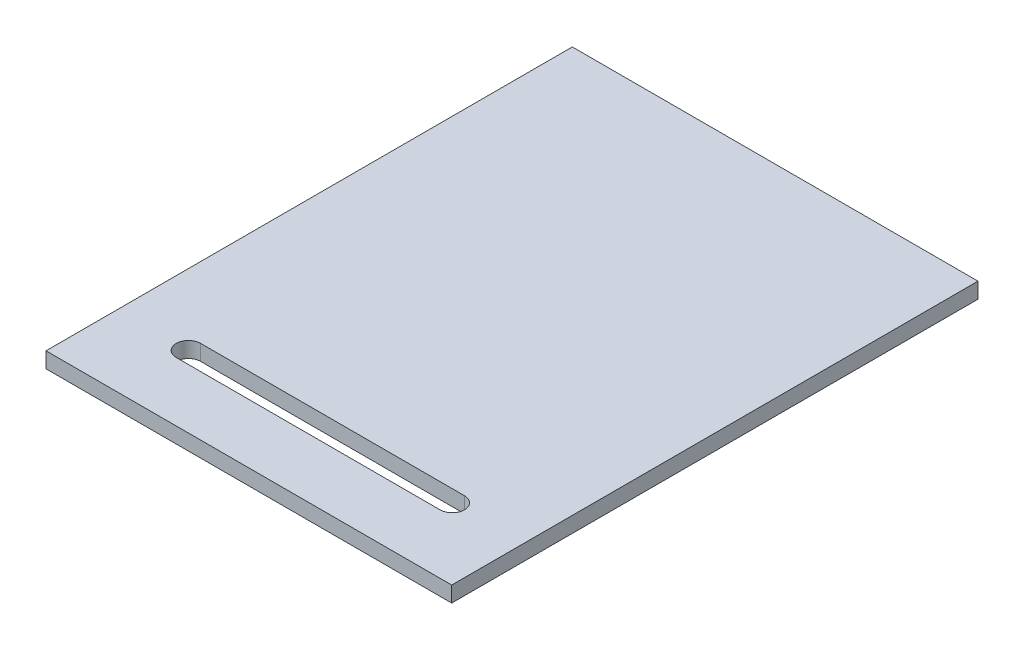
ISO-10303-21;
HEADER;
FILE_DESCRIPTION(('STEP AP214'),'2;1');
FILE_NAME('part.step','',(''),(''),'','','');
FILE_SCHEMA(('AUTOMOTIVE_DESIGN { 1 0 10303 214 1 1 1 1 }'));
ENDSEC;
DATA;
#1=APPLICATION_CONTEXT('core data for automotive mechanical design processes');
#2=APPLICATION_PROTOCOL_DEFINITION('international standard','automotive_design',2000,#1);
#3=PRODUCT_CONTEXT('',#1,'mechanical');
#4=PRODUCT('Part','Part','',(#3));
#5=PRODUCT_RELATED_PRODUCT_CATEGORY('part','',(#4));
#6=PRODUCT_DEFINITION_FORMATION('','',#4);
#7=PRODUCT_DEFINITION_CONTEXT('part definition',#1,'design');
#8=PRODUCT_DEFINITION('design','',#6,#7);
#9=PRODUCT_DEFINITION_SHAPE('','',#8);
#10=(LENGTH_UNIT() NAMED_UNIT(*) SI_UNIT(.MILLI.,.METRE.));
#11=(NAMED_UNIT(*) PLANE_ANGLE_UNIT() SI_UNIT($,.RADIAN.));
#12=(NAMED_UNIT(*) SI_UNIT($,.STERADIAN.) SOLID_ANGLE_UNIT());
#13=UNCERTAINTY_MEASURE_WITH_UNIT(LENGTH_MEASURE(1.E-05),#10,'distance_accuracy_value','');
#14=(GEOMETRIC_REPRESENTATION_CONTEXT(3) GLOBAL_UNCERTAINTY_ASSIGNED_CONTEXT((#13)) GLOBAL_UNIT_ASSIGNED_CONTEXT((#10,
#11,#12)) REPRESENTATION_CONTEXT('',''));
#15=CARTESIAN_POINT('',(0.,0.,0.));
#16=DIRECTION('',(0.,0.,1.));
#17=DIRECTION('',(1.,0.,0.));
#18=AXIS2_PLACEMENT_3D('',#15,#16,#17);
#19=CARTESIAN_POINT('',(20.7585943571992,1.6,0.));
#20=DIRECTION('',(1.,0.,0.));
#21=DIRECTION('',(0.,0.,-1.));
#22=AXIS2_PLACEMENT_3D('',#19,#20,#21);
#23=PLANE('',#22);
#24=DIRECTION('',(0.,0.,1.));
#25=VECTOR('',#24,1.);
#26=CARTESIAN_POINT('',(20.7585943571992,0.,0.));
#27=LINE('',#26,#25);
#28=CARTESIAN_POINT('',(20.7585943571992,0.,-26.9301755087161));
#29=VERTEX_POINT('',#28);
#30=CARTESIAN_POINT('',(20.7585943571992,0.,26.9301755087161));
#31=VERTEX_POINT('',#30);
#32=EDGE_CURVE('E163',#29,#31,#27,.T.);
#33=ORIENTED_EDGE('',*,*,#32,.F.);
#34=DIRECTION('',(0.,-1.,0.));
#35=VECTOR('',#34,1.);
#36=CARTESIAN_POINT('',(20.7585943571992,1.6,-26.9301755087161));
#37=LINE('',#36,#35);
#38=CARTESIAN_POINT('',(20.7585943571992,1.6,-26.9301755087161));
#39=VERTEX_POINT('',#38);
#40=EDGE_CURVE('E11',#39,#29,#37,.T.);
#41=ORIENTED_EDGE('',*,*,#40,.F.);
#42=DIRECTION('',(0.,0.,1.));
#43=VECTOR('',#42,1.);
#44=CARTESIAN_POINT('',(20.7585943571992,1.6,0.));
#45=LINE('',#44,#43);
#46=CARTESIAN_POINT('',(20.7585943571992,1.6,26.9301755087161));
#47=VERTEX_POINT('',#46);
#48=EDGE_CURVE('E138',#39,#47,#45,.T.);
#49=ORIENTED_EDGE('',*,*,#48,.T.);
#50=DIRECTION('',(0.,-1.,0.));
#51=VECTOR('',#50,1.);
#52=CARTESIAN_POINT('',(20.7585943571992,1.6,26.9301755087161));
#53=LINE('',#52,#51);
#54=EDGE_CURVE('E98',#47,#31,#53,.T.);
#55=ORIENTED_EDGE('',*,*,#54,.T.);
#56=EDGE_LOOP('',(#33,#41,#49,#55));
#57=FACE_BOUND('',#56,.T.);
#58=ADVANCED_FACE('F43',(#57),#23,.T.);
#59=CARTESIAN_POINT('',(0.,1.6,-26.9301755087161));
#60=DIRECTION('',(0.,0.,-1.));
#61=DIRECTION('',(-1.,0.,0.));
#62=AXIS2_PLACEMENT_3D('',#59,#60,#61);
#63=PLANE('',#62);
#64=DIRECTION('',(1.,0.,0.));
#65=VECTOR('',#64,1.);
#66=CARTESIAN_POINT('',(0.,0.,-26.9301755087161));
#67=LINE('',#66,#65);
#68=CARTESIAN_POINT('',(-20.7585943571992,0.,-26.9301755087161));
#69=VERTEX_POINT('',#68);
#70=EDGE_CURVE('E126',#69,#29,#67,.T.);
#71=ORIENTED_EDGE('',*,*,#70,.F.);
#72=DIRECTION('',(0.,-1.,0.));
#73=VECTOR('',#72,1.);
#74=CARTESIAN_POINT('',(-20.7585943571992,1.6,-26.9301755087161));
#75=LINE('',#74,#73);
#76=CARTESIAN_POINT('',(-20.7585943571992,1.6,-26.9301755087161));
#77=VERTEX_POINT('',#76);
#78=EDGE_CURVE('E54',#77,#69,#75,.T.);
#79=ORIENTED_EDGE('',*,*,#78,.F.);
#80=DIRECTION('',(1.,0.,0.));
#81=VECTOR('',#80,1.);
#82=CARTESIAN_POINT('',(0.,1.6,-26.9301755087161));
#83=LINE('',#82,#81);
#84=EDGE_CURVE('E124',#77,#39,#83,.T.);
#85=ORIENTED_EDGE('',*,*,#84,.T.);
#86=ORIENTED_EDGE('',*,*,#40,.T.);
#87=EDGE_LOOP('',(#71,#79,#85,#86));
#88=FACE_BOUND('',#87,.T.);
#89=ADVANCED_FACE('F122',(#88),#63,.T.);
#90=CARTESIAN_POINT('',(-20.7585943571992,1.6,0.));
#91=DIRECTION('',(1.,0.,0.));
#92=DIRECTION('',(0.,0.,-1.));
#93=AXIS2_PLACEMENT_3D('',#90,#91,#92);
#94=PLANE('',#93);
#95=DIRECTION('',(0.,0.,1.));
#96=VECTOR('',#95,1.);
#97=CARTESIAN_POINT('',(-20.7585943571992,0.,0.));
#98=LINE('',#97,#96);
#99=CARTESIAN_POINT('',(-20.7585943571992,0.,26.9301755087161));
#100=VERTEX_POINT('',#99);
#101=EDGE_CURVE('E168',#69,#100,#98,.T.);
#102=ORIENTED_EDGE('',*,*,#101,.T.);
#103=DIRECTION('',(0.,-1.,0.));
#104=VECTOR('',#103,1.);
#105=CARTESIAN_POINT('',(-20.7585943571992,1.6,26.9301755087161));
#106=LINE('',#105,#104);
#107=CARTESIAN_POINT('',(-20.7585943571992,1.6,26.9301755087161));
#108=VERTEX_POINT('',#107);
#109=EDGE_CURVE('E130',#108,#100,#106,.T.);
#110=ORIENTED_EDGE('',*,*,#109,.F.);
#111=DIRECTION('',(0.,0.,1.));
#112=VECTOR('',#111,1.);
#113=CARTESIAN_POINT('',(-20.7585943571992,1.6,0.));
#114=LINE('',#113,#112);
#115=EDGE_CURVE('E133',#77,#108,#114,.T.);
#116=ORIENTED_EDGE('',*,*,#115,.F.);
#117=ORIENTED_EDGE('',*,*,#78,.T.);
#118=EDGE_LOOP('',(#102,#110,#116,#117));
#119=FACE_BOUND('',#118,.T.);
#120=ADVANCED_FACE('F134',(#119),#94,.F.);
#121=CARTESIAN_POINT('',(-13.5,1.6,19.6109910542516));
#122=DIRECTION('',(0.,-1.,0.));
#123=DIRECTION('',(0.,0.,-1.));
#124=AXIS2_PLACEMENT_3D('',#121,#122,#123);
#125=CYLINDRICAL_SURFACE('',#124,1.25);
#126=CARTESIAN_POINT('',(-13.5,0.,19.6109910542516));
#127=DIRECTION('',(0.,1.,0.));
#128=DIRECTION('',(0.,0.,1.));
#129=AXIS2_PLACEMENT_3D('',#126,#127,#128);
#130=CIRCLE('',#129,1.25);
#131=CARTESIAN_POINT('',(-13.5,0.,18.3609910542516));
#132=VERTEX_POINT('',#131);
#133=CARTESIAN_POINT('',(-13.5,0.,20.8609910542516));
#134=VERTEX_POINT('',#133);
#135=EDGE_CURVE('E149',#132,#134,#130,.T.);
#136=ORIENTED_EDGE('',*,*,#135,.F.);
#137=DIRECTION('',(0.,-1.,0.));
#138=VECTOR('',#137,1.);
#139=CARTESIAN_POINT('',(-13.5,1.6,18.3609910542516));
#140=LINE('',#139,#138);
#141=CARTESIAN_POINT('',(-13.5,1.6,18.3609910542516));
#142=VERTEX_POINT('',#141);
#143=EDGE_CURVE('E47',#142,#132,#140,.T.);
#144=ORIENTED_EDGE('',*,*,#143,.F.);
#145=CARTESIAN_POINT('',(-13.5,1.6,19.6109910542516));
#146=DIRECTION('',(0.,1.,0.));
#147=DIRECTION('',(0.,0.,1.));
#148=AXIS2_PLACEMENT_3D('',#145,#146,#147);
#149=CIRCLE('',#148,1.25);
#150=CARTESIAN_POINT('',(-13.5,1.6,20.8609910542516));
#151=VERTEX_POINT('',#150);
#152=EDGE_CURVE('E173',#142,#151,#149,.T.);
#153=ORIENTED_EDGE('',*,*,#152,.T.);
#154=DIRECTION('',(0.,-1.,0.));
#155=VECTOR('',#154,1.);
#156=CARTESIAN_POINT('',(-13.5,1.6,20.8609910542516));
#157=LINE('',#156,#155);
#158=EDGE_CURVE('E148',#151,#134,#157,.T.);
#159=ORIENTED_EDGE('',*,*,#158,.T.);
#160=EDGE_LOOP('',(#136,#144,#153,#159));
#161=FACE_BOUND('',#160,.T.);
#162=ADVANCED_FACE('F45',(#161),#125,.F.);
#163=CARTESIAN_POINT('',(0.,1.6,18.3609910542516));
#164=DIRECTION('',(0.,0.,-1.));
#165=DIRECTION('',(-1.,0.,0.));
#166=AXIS2_PLACEMENT_3D('',#163,#164,#165);
#167=PLANE('',#166);
#168=DIRECTION('',(1.,0.,0.));
#169=VECTOR('',#168,1.);
#170=CARTESIAN_POINT('',(0.,0.,18.3609910542516));
#171=LINE('',#170,#169);
#172=CARTESIAN_POINT('',(13.5,0.,18.3609910542516));
#173=VERTEX_POINT('',#172);
#174=EDGE_CURVE('E153',#132,#173,#171,.T.);
#175=ORIENTED_EDGE('',*,*,#174,.T.);
#176=DIRECTION('',(0.,-1.,0.));
#177=VECTOR('',#176,1.);
#178=CARTESIAN_POINT('',(13.5,1.6,18.3609910542516));
#179=LINE('',#178,#177);
#180=CARTESIAN_POINT('',(13.5,1.6,18.3609910542516));
#181=VERTEX_POINT('',#180);
#182=EDGE_CURVE('E183',#181,#173,#179,.T.);
#183=ORIENTED_EDGE('',*,*,#182,.F.);
#184=DIRECTION('',(1.,0.,0.));
#185=VECTOR('',#184,1.);
#186=CARTESIAN_POINT('',(0.,1.6,18.3609910542516));
#187=LINE('',#186,#185);
#188=EDGE_CURVE('E194',#142,#181,#187,.T.);
#189=ORIENTED_EDGE('',*,*,#188,.F.);
#190=ORIENTED_EDGE('',*,*,#143,.T.);
#191=EDGE_LOOP('',(#175,#183,#189,#190));
#192=FACE_BOUND('',#191,.T.);
#193=ADVANCED_FACE('F193',(#192),#167,.F.);
#194=CARTESIAN_POINT('',(13.5,1.6,19.6109910542516));
#195=DIRECTION('',(0.,-1.,0.));
#196=DIRECTION('',(0.,0.,-1.));
#197=AXIS2_PLACEMENT_3D('',#194,#195,#196);
#198=CYLINDRICAL_SURFACE('',#197,1.25);
#199=CARTESIAN_POINT('',(13.5,0.,19.6109910542516));
#200=DIRECTION('',(0.,1.,0.));
#201=DIRECTION('',(0.,0.,1.));
#202=AXIS2_PLACEMENT_3D('',#199,#200,#201);
#203=CIRCLE('',#202,1.25);
#204=CARTESIAN_POINT('',(13.5,0.,20.8609910542516));
#205=VERTEX_POINT('',#204);
#206=EDGE_CURVE('E156',#173,#205,#203,.F.);
#207=ORIENTED_EDGE('',*,*,#206,.T.);
#208=DIRECTION('',(0.,-1.,0.));
#209=VECTOR('',#208,1.);
#210=CARTESIAN_POINT('',(13.5,1.6,20.8609910542516));
#211=LINE('',#210,#209);
#212=CARTESIAN_POINT('',(13.5,1.6,20.8609910542516));
#213=VERTEX_POINT('',#212);
#214=EDGE_CURVE('E180',#213,#205,#211,.T.);
#215=ORIENTED_EDGE('',*,*,#214,.F.);
#216=CARTESIAN_POINT('',(13.5,1.6,19.6109910542516));
#217=DIRECTION('',(0.,1.,0.));
#218=DIRECTION('',(0.,0.,1.));
#219=AXIS2_PLACEMENT_3D('',#216,#217,#218);
#220=CIRCLE('',#219,1.25);
#221=EDGE_CURVE('E205',#181,#213,#220,.F.);
#222=ORIENTED_EDGE('',*,*,#221,.F.);
#223=ORIENTED_EDGE('',*,*,#182,.T.);
#224=EDGE_LOOP('',(#207,#215,#222,#223));
#225=FACE_BOUND('',#224,.T.);
#226=ADVANCED_FACE('F204',(#225),#198,.F.);
#227=CARTESIAN_POINT('',(0.,1.6,20.8609910542516));
#228=DIRECTION('',(0.,0.,1.));
#229=DIRECTION('',(1.,0.,0.));
#230=AXIS2_PLACEMENT_3D('',#227,#228,#229);
#231=PLANE('',#230);
#232=DIRECTION('',(-1.,0.,0.));
#233=VECTOR('',#232,1.);
#234=CARTESIAN_POINT('',(0.,0.,20.8609910542516));
#235=LINE('',#234,#233);
#236=EDGE_CURVE('E159',#205,#134,#235,.T.);
#237=ORIENTED_EDGE('',*,*,#236,.T.);
#238=ORIENTED_EDGE('',*,*,#158,.F.);
#239=DIRECTION('',(-1.,0.,0.));
#240=VECTOR('',#239,1.);
#241=CARTESIAN_POINT('',(0.,1.6,20.8609910542516));
#242=LINE('',#241,#240);
#243=EDGE_CURVE('E142',#213,#151,#242,.T.);
#244=ORIENTED_EDGE('',*,*,#243,.F.);
#245=ORIENTED_EDGE('',*,*,#214,.T.);
#246=EDGE_LOOP('',(#237,#238,#244,#245));
#247=FACE_BOUND('',#246,.T.);
#248=ADVANCED_FACE('F202',(#247),#231,.F.);
#249=CARTESIAN_POINT('',(0.,1.6,26.9301755087161));
#250=DIRECTION('',(0.,0.,-1.));
#251=DIRECTION('',(-1.,0.,0.));
#252=AXIS2_PLACEMENT_3D('',#249,#250,#251);
#253=PLANE('',#252);
#254=DIRECTION('',(1.,0.,0.));
#255=VECTOR('',#254,1.);
#256=CARTESIAN_POINT('',(0.,0.,26.9301755087161));
#257=LINE('',#256,#255);
#258=EDGE_CURVE('E91',#100,#31,#257,.T.);
#259=ORIENTED_EDGE('',*,*,#258,.T.);
#260=ORIENTED_EDGE('',*,*,#54,.F.);
#261=DIRECTION('',(1.,0.,0.));
#262=VECTOR('',#261,1.);
#263=CARTESIAN_POINT('',(0.,1.6,26.9301755087161));
#264=LINE('',#263,#262);
#265=EDGE_CURVE('E63',#108,#47,#264,.T.);
#266=ORIENTED_EDGE('',*,*,#265,.F.);
#267=ORIENTED_EDGE('',*,*,#109,.T.);
#268=EDGE_LOOP('',(#259,#260,#266,#267));
#269=FACE_BOUND('',#268,.T.);
#270=ADVANCED_FACE('F215',(#269),#253,.F.);
#271=CARTESIAN_POINT('',(0.,1.6,0.));
#272=DIRECTION('',(0.,1.,0.));
#273=DIRECTION('',(0.,0.,1.));
#274=AXIS2_PLACEMENT_3D('',#271,#272,#273);
#275=PLANE('',#274);
#276=ORIENTED_EDGE('',*,*,#152,.F.);
#277=ORIENTED_EDGE('',*,*,#188,.T.);
#278=ORIENTED_EDGE('',*,*,#221,.T.);
#279=ORIENTED_EDGE('',*,*,#243,.T.);
#280=EDGE_LOOP('',(#276,#277,#278,#279));
#281=FACE_BOUND('',#280,.T.);
#282=ORIENTED_EDGE('',*,*,#48,.F.);
#283=ORIENTED_EDGE('',*,*,#84,.F.);
#284=ORIENTED_EDGE('',*,*,#115,.T.);
#285=ORIENTED_EDGE('',*,*,#265,.T.);
#286=EDGE_LOOP('',(#282,#283,#284,#285));
#287=FACE_BOUND('',#286,.T.);
#288=ADVANCED_FACE('F137',(#281,#287),#275,.T.);
#289=CARTESIAN_POINT('',(0.,0.,0.));
#290=DIRECTION('',(0.,1.,0.));
#291=DIRECTION('',(0.,0.,1.));
#292=AXIS2_PLACEMENT_3D('',#289,#290,#291);
#293=PLANE('',#292);
#294=ORIENTED_EDGE('',*,*,#135,.T.);
#295=ORIENTED_EDGE('',*,*,#236,.F.);
#296=ORIENTED_EDGE('',*,*,#206,.F.);
#297=ORIENTED_EDGE('',*,*,#174,.F.);
#298=EDGE_LOOP('',(#294,#295,#296,#297));
#299=FACE_BOUND('',#298,.T.);
#300=ORIENTED_EDGE('',*,*,#32,.T.);
#301=ORIENTED_EDGE('',*,*,#258,.F.);
#302=ORIENTED_EDGE('',*,*,#101,.F.);
#303=ORIENTED_EDGE('',*,*,#70,.T.);
#304=EDGE_LOOP('',(#300,#301,#302,#303));
#305=FACE_BOUND('',#304,.T.);
#306=ADVANCED_FACE('F197',(#299,#305),#293,.F.);
#307=CLOSED_SHELL('',(#58,#89,#120,#162,#193,#226,#248,#270,#288,#306));
#308=MANIFOLD_SOLID_BREP('B2',#307);
#309=ADVANCED_BREP_SHAPE_REPRESENTATION('',(#18,#308),#14);
#310=SHAPE_DEFINITION_REPRESENTATION(#9,#309);
ENDSEC;
END-ISO-10303-21;
